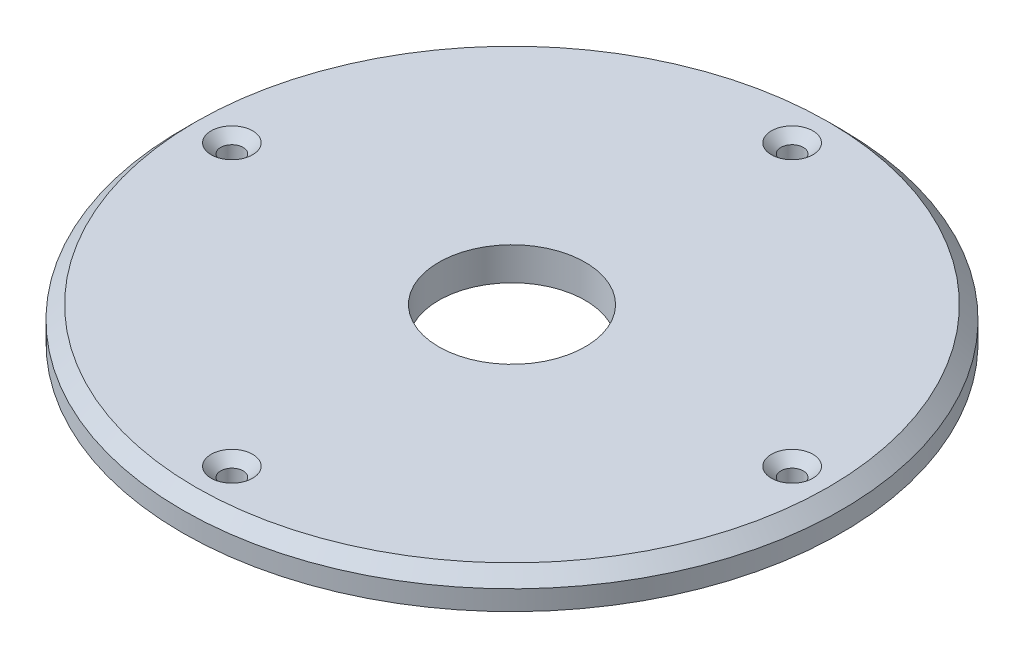
ISO-10303-21;
HEADER;
FILE_DESCRIPTION(('STEP AP214'),'2;1');
FILE_NAME('part.step','',(''),(''),'','','');
FILE_SCHEMA(('AUTOMOTIVE_DESIGN { 1 0 10303 214 1 1 1 1 }'));
ENDSEC;
DATA;
#1=APPLICATION_CONTEXT('core data for automotive mechanical design processes');
#2=APPLICATION_PROTOCOL_DEFINITION('international standard','automotive_design',2000,#1);
#3=PRODUCT_CONTEXT('',#1,'mechanical');
#4=PRODUCT('Part','Part','',(#3));
#5=PRODUCT_RELATED_PRODUCT_CATEGORY('part','',(#4));
#6=PRODUCT_DEFINITION_FORMATION('','',#4);
#7=PRODUCT_DEFINITION_CONTEXT('part definition',#1,'design');
#8=PRODUCT_DEFINITION('design','',#6,#7);
#9=PRODUCT_DEFINITION_SHAPE('','',#8);
#10=(LENGTH_UNIT() NAMED_UNIT(*) SI_UNIT(.MILLI.,.METRE.));
#11=(NAMED_UNIT(*) PLANE_ANGLE_UNIT() SI_UNIT($,.RADIAN.));
#12=(NAMED_UNIT(*) SI_UNIT($,.STERADIAN.) SOLID_ANGLE_UNIT());
#13=UNCERTAINTY_MEASURE_WITH_UNIT(LENGTH_MEASURE(1.E-05),#10,'distance_accuracy_value','');
#14=(GEOMETRIC_REPRESENTATION_CONTEXT(3) GLOBAL_UNCERTAINTY_ASSIGNED_CONTEXT((#13)) GLOBAL_UNIT_ASSIGNED_CONTEXT((#10,
#11,#12)) REPRESENTATION_CONTEXT('',''));
#15=CARTESIAN_POINT('',(0.,0.,0.));
#16=DIRECTION('',(0.,0.,1.));
#17=DIRECTION('',(1.,0.,0.));
#18=AXIS2_PLACEMENT_3D('',#15,#16,#17);
#19=CARTESIAN_POINT('',(0.,5.,0.));
#20=DIRECTION('',(0.,1.,0.));
#21=DIRECTION('',(0.,0.,1.));
#22=AXIS2_PLACEMENT_3D('',#19,#20,#21);
#23=PLANE('',#22);
#24=CARTESIAN_POINT('',(0.,5.,0.));
#25=DIRECTION('',(0.,1.,0.));
#26=DIRECTION('',(0.,0.,1.));
#27=AXIS2_PLACEMENT_3D('',#24,#25,#26);
#28=CIRCLE('',#27,48.);
#29=CARTESIAN_POINT('',(0.,5.,48.));
#30=VERTEX_POINT('',#29);
#31=EDGE_CURVE('E54',#30,#30,#28,.T.);
#32=ORIENTED_EDGE('',*,*,#31,.T.);
#33=EDGE_LOOP('',(#32));
#34=FACE_BOUND('',#33,.T.);
#35=CARTESIAN_POINT('',(-42.5,5.,-4.451638707025E-13));
#36=DIRECTION('',(0.,1.,0.));
#37=DIRECTION('',(0.,0.,1.));
#38=AXIS2_PLACEMENT_3D('',#35,#36,#37);
#39=CIRCLE('',#38,3.15);
#40=CARTESIAN_POINT('',(-42.5,5.,3.14999999999955));
#41=VERTEX_POINT('',#40);
#42=EDGE_CURVE('E118',#41,#41,#39,.T.);
#43=ORIENTED_EDGE('',*,*,#42,.F.);
#44=EDGE_LOOP('',(#43));
#45=FACE_BOUND('',#44,.T.);
#46=CARTESIAN_POINT('',(0.,5.,42.5));
#47=DIRECTION('',(0.,1.,0.));
#48=DIRECTION('',(0.,0.,1.));
#49=AXIS2_PLACEMENT_3D('',#46,#47,#48);
#50=CIRCLE('',#49,3.15);
#51=CARTESIAN_POINT('',(0.,5.,45.65));
#52=VERTEX_POINT('',#51);
#53=EDGE_CURVE('E106',#52,#52,#50,.T.);
#54=ORIENTED_EDGE('',*,*,#53,.F.);
#55=EDGE_LOOP('',(#54));
#56=FACE_BOUND('',#55,.T.);
#57=CARTESIAN_POINT('',(42.5,5.,1.48387956900833E-13));
#58=DIRECTION('',(0.,1.,0.));
#59=DIRECTION('',(0.,0.,1.));
#60=AXIS2_PLACEMENT_3D('',#57,#58,#59);
#61=CIRCLE('',#60,3.15);
#62=CARTESIAN_POINT('',(42.5,5.,3.15000000000015));
#63=VERTEX_POINT('',#62);
#64=EDGE_CURVE('E94',#63,#63,#61,.T.);
#65=ORIENTED_EDGE('',*,*,#64,.F.);
#66=EDGE_LOOP('',(#65));
#67=FACE_BOUND('',#66,.T.);
#68=CARTESIAN_POINT('',(0.,5.,-42.5));
#69=DIRECTION('',(0.,1.,0.));
#70=DIRECTION('',(0.,0.,1.));
#71=AXIS2_PLACEMENT_3D('',#68,#69,#70);
#72=CIRCLE('',#71,3.15);
#73=CARTESIAN_POINT('',(0.,5.,-39.35));
#74=VERTEX_POINT('',#73);
#75=EDGE_CURVE('E82',#74,#74,#72,.T.);
#76=ORIENTED_EDGE('',*,*,#75,.F.);
#77=EDGE_LOOP('',(#76));
#78=FACE_BOUND('',#77,.T.);
#79=CARTESIAN_POINT('',(0.,5.,0.));
#80=DIRECTION('',(0.,1.,0.));
#81=DIRECTION('',(0.,0.,1.));
#82=AXIS2_PLACEMENT_3D('',#79,#80,#81);
#83=CIRCLE('',#82,11.1125);
#84=CARTESIAN_POINT('',(0.,5.,11.1125));
#85=VERTEX_POINT('',#84);
#86=EDGE_CURVE('E64',#85,#85,#83,.T.);
#87=ORIENTED_EDGE('',*,*,#86,.F.);
#88=EDGE_LOOP('',(#87));
#89=FACE_BOUND('',#88,.T.);
#90=ADVANCED_FACE('F45',(#34,#45,#56,#67,#78,#89),#23,.T.);
#91=CARTESIAN_POINT('',(0.,0.,0.));
#92=DIRECTION('',(0.,1.,0.));
#93=DIRECTION('',(0.,0.,1.));
#94=AXIS2_PLACEMENT_3D('',#91,#92,#93);
#95=PLANE('',#94);
#96=CARTESIAN_POINT('',(-42.5,0.,-4.451638707025E-13));
#97=DIRECTION('',(0.,1.,0.));
#98=DIRECTION('',(0.,0.,1.));
#99=AXIS2_PLACEMENT_3D('',#96,#97,#98);
#100=CIRCLE('',#99,1.7);
#101=CARTESIAN_POINT('',(-42.5,0.,1.69999999999955));
#102=VERTEX_POINT('',#101);
#103=EDGE_CURVE('E110',#102,#102,#100,.T.);
#104=ORIENTED_EDGE('',*,*,#103,.T.);
#105=EDGE_LOOP('',(#104));
#106=FACE_BOUND('',#105,.T.);
#107=CARTESIAN_POINT('',(0.,0.,42.5));
#108=DIRECTION('',(0.,1.,0.));
#109=DIRECTION('',(0.,0.,1.));
#110=AXIS2_PLACEMENT_3D('',#107,#108,#109);
#111=CIRCLE('',#110,1.7);
#112=CARTESIAN_POINT('',(0.,0.,44.2));
#113=VERTEX_POINT('',#112);
#114=EDGE_CURVE('E98',#113,#113,#111,.T.);
#115=ORIENTED_EDGE('',*,*,#114,.T.);
#116=EDGE_LOOP('',(#115));
#117=FACE_BOUND('',#116,.T.);
#118=CARTESIAN_POINT('',(42.5,0.,1.48387956900833E-13));
#119=DIRECTION('',(0.,1.,0.));
#120=DIRECTION('',(0.,0.,1.));
#121=AXIS2_PLACEMENT_3D('',#118,#119,#120);
#122=CIRCLE('',#121,1.7);
#123=CARTESIAN_POINT('',(42.5,0.,1.70000000000015));
#124=VERTEX_POINT('',#123);
#125=EDGE_CURVE('E86',#124,#124,#122,.T.);
#126=ORIENTED_EDGE('',*,*,#125,.T.);
#127=EDGE_LOOP('',(#126));
#128=FACE_BOUND('',#127,.T.);
#129=CARTESIAN_POINT('',(0.,0.,-42.5));
#130=DIRECTION('',(0.,1.,0.));
#131=DIRECTION('',(0.,0.,1.));
#132=AXIS2_PLACEMENT_3D('',#129,#130,#131);
#133=CIRCLE('',#132,1.7);
#134=CARTESIAN_POINT('',(0.,0.,-40.8));
#135=VERTEX_POINT('',#134);
#136=EDGE_CURVE('E71',#135,#135,#133,.T.);
#137=ORIENTED_EDGE('',*,*,#136,.T.);
#138=EDGE_LOOP('',(#137));
#139=FACE_BOUND('',#138,.T.);
#140=CARTESIAN_POINT('',(0.,0.,0.));
#141=DIRECTION('',(0.,1.,0.));
#142=DIRECTION('',(0.,0.,1.));
#143=AXIS2_PLACEMENT_3D('',#140,#141,#142);
#144=CIRCLE('',#143,50.);
#145=CARTESIAN_POINT('',(0.,0.,50.));
#146=VERTEX_POINT('',#145);
#147=EDGE_CURVE('E59',#146,#146,#144,.T.);
#148=ORIENTED_EDGE('',*,*,#147,.F.);
#149=EDGE_LOOP('',(#148));
#150=FACE_BOUND('',#149,.T.);
#151=CARTESIAN_POINT('',(0.,0.,0.));
#152=DIRECTION('',(0.,1.,0.));
#153=DIRECTION('',(0.,0.,1.));
#154=AXIS2_PLACEMENT_3D('',#151,#152,#153);
#155=CIRCLE('',#154,11.1125);
#156=CARTESIAN_POINT('',(0.,0.,11.1125));
#157=VERTEX_POINT('',#156);
#158=EDGE_CURVE('E67',#157,#157,#155,.T.);
#159=ORIENTED_EDGE('',*,*,#158,.T.);
#160=EDGE_LOOP('',(#159));
#161=FACE_BOUND('',#160,.T.);
#162=ADVANCED_FACE('F127',(#106,#117,#128,#139,#150,#161),#95,.F.);
#163=CARTESIAN_POINT('',(0.,5.,0.));
#164=DIRECTION('',(0.,-1.,0.));
#165=DIRECTION('',(0.,0.,-1.));
#166=AXIS2_PLACEMENT_3D('',#163,#164,#165);
#167=CYLINDRICAL_SURFACE('',#166,50.);
#168=CARTESIAN_POINT('',(0.,2.99999999999996,0.));
#169=DIRECTION('',(0.,1.,0.));
#170=DIRECTION('',(0.,0.,1.));
#171=AXIS2_PLACEMENT_3D('',#168,#169,#170);
#172=CIRCLE('',#171,50.);
#173=CARTESIAN_POINT('',(0.,2.99999999999996,50.));
#174=VERTEX_POINT('',#173);
#175=EDGE_CURVE('E10',#174,#174,#172,.F.);
#176=ORIENTED_EDGE('',*,*,#175,.T.);
#177=EDGE_LOOP('',(#176));
#178=FACE_BOUND('',#177,.T.);
#179=ORIENTED_EDGE('',*,*,#147,.T.);
#180=EDGE_LOOP('',(#179));
#181=FACE_BOUND('',#180,.T.);
#182=ADVANCED_FACE('F141',(#178,#181),#167,.T.);
#183=CARTESIAN_POINT('',(0.,5.,0.));
#184=DIRECTION('',(0.,-1.,0.));
#185=DIRECTION('',(0.,0.,-1.));
#186=AXIS2_PLACEMENT_3D('',#183,#184,#185);
#187=CYLINDRICAL_SURFACE('',#186,11.1125);
#188=ORIENTED_EDGE('',*,*,#86,.T.);
#189=EDGE_LOOP('',(#188));
#190=FACE_BOUND('',#189,.T.);
#191=ORIENTED_EDGE('',*,*,#158,.F.);
#192=EDGE_LOOP('',(#191));
#193=FACE_BOUND('',#192,.T.);
#194=ADVANCED_FACE('F137',(#190,#193),#187,.F.);
#195=CARTESIAN_POINT('',(0.,5.,-42.5));
#196=DIRECTION('',(0.,1.,0.));
#197=DIRECTION('',(0.,0.,1.));
#198=AXIS2_PLACEMENT_3D('',#195,#196,#197);
#199=CYLINDRICAL_SURFACE('',#198,1.7);
#200=ORIENTED_EDGE('',*,*,#136,.F.);
#201=EDGE_LOOP('',(#200));
#202=FACE_BOUND('',#201,.T.);
#203=CARTESIAN_POINT('',(0.,3.55,-42.5));
#204=DIRECTION('',(0.,1.,0.));
#205=DIRECTION('',(0.,0.,1.));
#206=AXIS2_PLACEMENT_3D('',#203,#204,#205);
#207=CIRCLE('',#206,1.7);
#208=CARTESIAN_POINT('',(0.,3.55,-40.8));
#209=VERTEX_POINT('',#208);
#210=EDGE_CURVE('E78',#209,#209,#207,.T.);
#211=ORIENTED_EDGE('',*,*,#210,.T.);
#212=EDGE_LOOP('',(#211));
#213=FACE_BOUND('',#212,.T.);
#214=ADVANCED_FACE('F140',(#202,#213),#199,.F.);
#215=CARTESIAN_POINT('',(0.,5.,-42.5));
#216=DIRECTION('',(0.,1.,0.));
#217=DIRECTION('',(0.,0.,1.));
#218=AXIS2_PLACEMENT_3D('',#215,#216,#217);
#219=CONICAL_SURFACE('',#218,3.15,0.785398163397447);
#220=ORIENTED_EDGE('',*,*,#210,.F.);
#221=EDGE_LOOP('',(#220));
#222=FACE_BOUND('',#221,.T.);
#223=ORIENTED_EDGE('',*,*,#75,.T.);
#224=EDGE_LOOP('',(#223));
#225=FACE_BOUND('',#224,.T.);
#226=ADVANCED_FACE('F157',(#222,#225),#219,.F.);
#227=CARTESIAN_POINT('',(42.5,5.,1.48387956900833E-13));
#228=DIRECTION('',(0.,1.,0.));
#229=DIRECTION('',(0.,0.,1.));
#230=AXIS2_PLACEMENT_3D('',#227,#228,#229);
#231=CYLINDRICAL_SURFACE('',#230,1.7);
#232=ORIENTED_EDGE('',*,*,#125,.F.);
#233=EDGE_LOOP('',(#232));
#234=FACE_BOUND('',#233,.T.);
#235=CARTESIAN_POINT('',(42.5,3.55,1.48387956900833E-13));
#236=DIRECTION('',(0.,1.,0.));
#237=DIRECTION('',(0.,0.,1.));
#238=AXIS2_PLACEMENT_3D('',#235,#236,#237);
#239=CIRCLE('',#238,1.7);
#240=CARTESIAN_POINT('',(42.5,3.55,1.70000000000015));
#241=VERTEX_POINT('',#240);
#242=EDGE_CURVE('E90',#241,#241,#239,.T.);
#243=ORIENTED_EDGE('',*,*,#242,.T.);
#244=EDGE_LOOP('',(#243));
#245=FACE_BOUND('',#244,.T.);
#246=ADVANCED_FACE('F160',(#234,#245),#231,.F.);
#247=CARTESIAN_POINT('',(42.5,5.,1.48387956900833E-13));
#248=DIRECTION('',(0.,1.,0.));
#249=DIRECTION('',(0.,0.,1.));
#250=AXIS2_PLACEMENT_3D('',#247,#248,#249);
#251=CONICAL_SURFACE('',#250,3.15,0.785398163397447);
#252=ORIENTED_EDGE('',*,*,#242,.F.);
#253=EDGE_LOOP('',(#252));
#254=FACE_BOUND('',#253,.T.);
#255=ORIENTED_EDGE('',*,*,#64,.T.);
#256=EDGE_LOOP('',(#255));
#257=FACE_BOUND('',#256,.T.);
#258=ADVANCED_FACE('F163',(#254,#257),#251,.F.);
#259=CARTESIAN_POINT('',(0.,5.,42.5));
#260=DIRECTION('',(0.,1.,0.));
#261=DIRECTION('',(0.,0.,1.));
#262=AXIS2_PLACEMENT_3D('',#259,#260,#261);
#263=CYLINDRICAL_SURFACE('',#262,1.7);
#264=ORIENTED_EDGE('',*,*,#114,.F.);
#265=EDGE_LOOP('',(#264));
#266=FACE_BOUND('',#265,.T.);
#267=CARTESIAN_POINT('',(0.,3.55,42.5));
#268=DIRECTION('',(0.,1.,0.));
#269=DIRECTION('',(0.,0.,1.));
#270=AXIS2_PLACEMENT_3D('',#267,#268,#269);
#271=CIRCLE('',#270,1.7);
#272=CARTESIAN_POINT('',(0.,3.55,44.2));
#273=VERTEX_POINT('',#272);
#274=EDGE_CURVE('E102',#273,#273,#271,.T.);
#275=ORIENTED_EDGE('',*,*,#274,.T.);
#276=EDGE_LOOP('',(#275));
#277=FACE_BOUND('',#276,.T.);
#278=ADVANCED_FACE('F167',(#266,#277),#263,.F.);
#279=CARTESIAN_POINT('',(0.,5.,42.5));
#280=DIRECTION('',(0.,1.,0.));
#281=DIRECTION('',(0.,0.,1.));
#282=AXIS2_PLACEMENT_3D('',#279,#280,#281);
#283=CONICAL_SURFACE('',#282,3.15,0.785398163397447);
#284=ORIENTED_EDGE('',*,*,#274,.F.);
#285=EDGE_LOOP('',(#284));
#286=FACE_BOUND('',#285,.T.);
#287=ORIENTED_EDGE('',*,*,#53,.T.);
#288=EDGE_LOOP('',(#287));
#289=FACE_BOUND('',#288,.T.);
#290=ADVANCED_FACE('F171',(#286,#289),#283,.F.);
#291=CARTESIAN_POINT('',(-42.5,5.,-4.451638707025E-13));
#292=DIRECTION('',(0.,1.,0.));
#293=DIRECTION('',(0.,0.,1.));
#294=AXIS2_PLACEMENT_3D('',#291,#292,#293);
#295=CYLINDRICAL_SURFACE('',#294,1.7);
#296=ORIENTED_EDGE('',*,*,#103,.F.);
#297=EDGE_LOOP('',(#296));
#298=FACE_BOUND('',#297,.T.);
#299=CARTESIAN_POINT('',(-42.5,3.55,-4.451638707025E-13));
#300=DIRECTION('',(0.,1.,0.));
#301=DIRECTION('',(0.,0.,1.));
#302=AXIS2_PLACEMENT_3D('',#299,#300,#301);
#303=CIRCLE('',#302,1.7);
#304=CARTESIAN_POINT('',(-42.5,3.55,1.69999999999955));
#305=VERTEX_POINT('',#304);
#306=EDGE_CURVE('E114',#305,#305,#303,.T.);
#307=ORIENTED_EDGE('',*,*,#306,.T.);
#308=EDGE_LOOP('',(#307));
#309=FACE_BOUND('',#308,.T.);
#310=ADVANCED_FACE('F175',(#298,#309),#295,.F.);
#311=CARTESIAN_POINT('',(-42.5,5.,-4.451638707025E-13));
#312=DIRECTION('',(0.,1.,0.));
#313=DIRECTION('',(0.,0.,1.));
#314=AXIS2_PLACEMENT_3D('',#311,#312,#313);
#315=CONICAL_SURFACE('',#314,3.15,0.785398163397447);
#316=ORIENTED_EDGE('',*,*,#306,.F.);
#317=EDGE_LOOP('',(#316));
#318=FACE_BOUND('',#317,.T.);
#319=ORIENTED_EDGE('',*,*,#42,.T.);
#320=EDGE_LOOP('',(#319));
#321=FACE_BOUND('',#320,.T.);
#322=ADVANCED_FACE('F123',(#318,#321),#315,.F.);
#323=CARTESIAN_POINT('',(0.,5.,0.));
#324=DIRECTION('',(0.,-1.,0.));
#325=DIRECTION('',(0.,0.,-1.));
#326=AXIS2_PLACEMENT_3D('',#323,#324,#325);
#327=CONICAL_SURFACE('',#326,48.,0.78539816339744);
#328=ORIENTED_EDGE('',*,*,#175,.F.);
#329=EDGE_LOOP('',(#328));
#330=FACE_BOUND('',#329,.T.);
#331=ORIENTED_EDGE('',*,*,#31,.F.);
#332=EDGE_LOOP('',(#331));
#333=FACE_BOUND('',#332,.T.);
#334=ADVANCED_FACE('F48',(#330,#333),#327,.T.);
#335=CLOSED_SHELL('',(#90,#162,#182,#194,#214,#226,#246,#258,#278,#290,#310,#322,#334));
#336=MANIFOLD_SOLID_BREP('B2',#335);
#337=ADVANCED_BREP_SHAPE_REPRESENTATION('',(#18,#336),#14);
#338=SHAPE_DEFINITION_REPRESENTATION(#9,#337);
ENDSEC;
END-ISO-10303-21;
